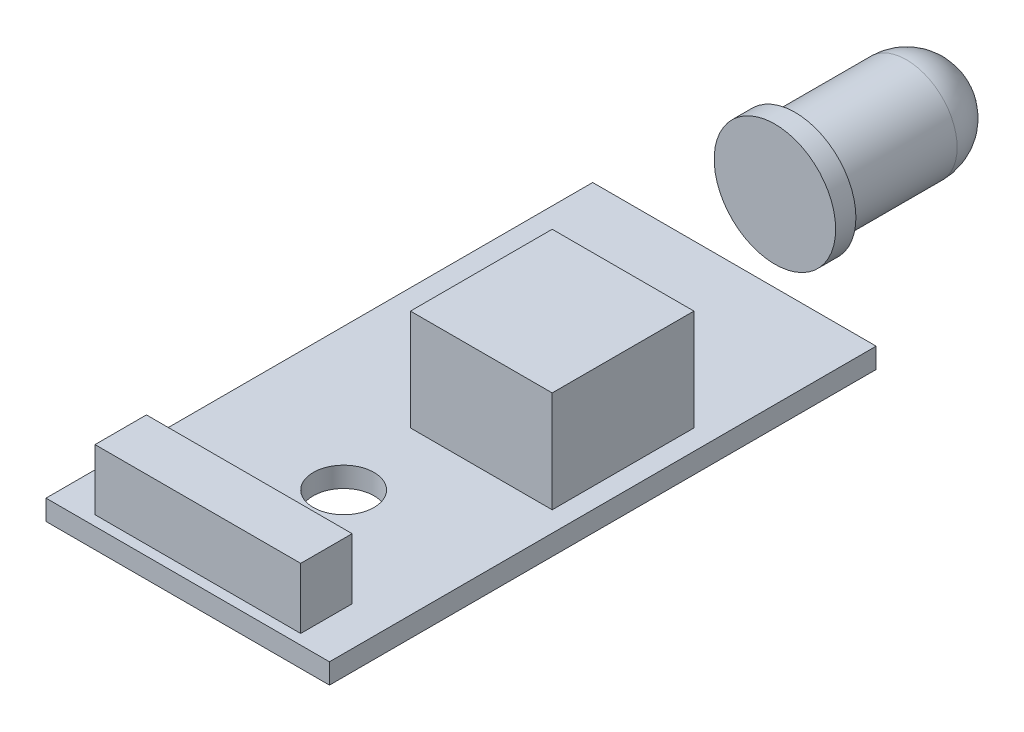
ISO-10303-21;
HEADER;
FILE_DESCRIPTION(('STEP AP214'),'2;1');
FILE_NAME('part.step','',(''),(''),'','','');
FILE_SCHEMA(('AUTOMOTIVE_DESIGN { 1 0 10303 214 1 1 1 1 }'));
ENDSEC;
DATA;
#1=APPLICATION_CONTEXT('core data for automotive mechanical design processes');
#2=APPLICATION_PROTOCOL_DEFINITION('international standard','automotive_design',2000,#1);
#3=PRODUCT_CONTEXT('',#1,'mechanical');
#4=PRODUCT('Part','Part','',(#3));
#5=PRODUCT_RELATED_PRODUCT_CATEGORY('part','',(#4));
#6=PRODUCT_DEFINITION_FORMATION('','',#4);
#7=PRODUCT_DEFINITION_CONTEXT('part definition',#1,'design');
#8=PRODUCT_DEFINITION('design','',#6,#7);
#9=PRODUCT_DEFINITION_SHAPE('','',#8);
#10=(LENGTH_UNIT() NAMED_UNIT(*) SI_UNIT(.MILLI.,.METRE.));
#11=(NAMED_UNIT(*) PLANE_ANGLE_UNIT() SI_UNIT($,.RADIAN.));
#12=(NAMED_UNIT(*) SI_UNIT($,.STERADIAN.) SOLID_ANGLE_UNIT());
#13=UNCERTAINTY_MEASURE_WITH_UNIT(LENGTH_MEASURE(1.E-05),#10,'distance_accuracy_value','');
#14=(GEOMETRIC_REPRESENTATION_CONTEXT(3) GLOBAL_UNCERTAINTY_ASSIGNED_CONTEXT((#13)) GLOBAL_UNIT_ASSIGNED_CONTEXT((#10,
#11,#12)) REPRESENTATION_CONTEXT('',''));
#15=CARTESIAN_POINT('',(0.,0.,0.));
#16=DIRECTION('',(0.,0.,1.));
#17=DIRECTION('',(1.,0.,0.));
#18=AXIS2_PLACEMENT_3D('',#15,#16,#17);
#19=CARTESIAN_POINT('',(0.,3.,-15.5));
#20=DIRECTION('',(0.,0.,-1.));
#21=DIRECTION('',(-1.,0.,0.));
#22=AXIS2_PLACEMENT_3D('',#19,#20,#21);
#23=PLANE('',#22);
#24=CARTESIAN_POINT('',(0.,3.,-15.5));
#25=DIRECTION('',(0.,0.,1.));
#26=DIRECTION('',(1.,0.,0.));
#27=AXIS2_PLACEMENT_3D('',#24,#25,#26);
#28=CIRCLE('',#27,3.);
#29=CARTESIAN_POINT('',(3.,3.,-15.5));
#30=VERTEX_POINT('',#29);
#31=EDGE_CURVE('E11',#30,#30,#28,.T.);
#32=ORIENTED_EDGE('',*,*,#31,.T.);
#33=EDGE_LOOP('',(#32));
#34=FACE_BOUND('',#33,.T.);
#35=ADVANCED_FACE('F47',(#34),#23,.F.);
#36=CARTESIAN_POINT('',(0.,3.,-15.5));
#37=DIRECTION('',(0.,0.,1.));
#38=DIRECTION('',(1.,0.,0.));
#39=AXIS2_PLACEMENT_3D('',#36,#37,#38);
#40=CYLINDRICAL_SURFACE('',#39,3.);
#41=ORIENTED_EDGE('',*,*,#31,.F.);
#42=EDGE_LOOP('',(#41));
#43=FACE_BOUND('',#42,.T.);
#44=CARTESIAN_POINT('',(0.,3.,-16.5));
#45=DIRECTION('',(0.,0.,1.));
#46=DIRECTION('',(1.,0.,0.));
#47=AXIS2_PLACEMENT_3D('',#44,#45,#46);
#48=CIRCLE('',#47,3.);
#49=CARTESIAN_POINT('',(3.,3.,-16.5));
#50=VERTEX_POINT('',#49);
#51=EDGE_CURVE('E53',#50,#50,#48,.T.);
#52=ORIENTED_EDGE('',*,*,#51,.T.);
#53=EDGE_LOOP('',(#52));
#54=FACE_BOUND('',#53,.T.);
#55=ADVANCED_FACE('F79',(#43,#54),#40,.T.);
#56=CARTESIAN_POINT('',(0.,6.,-16.5));
#57=DIRECTION('',(0.,0.,1.));
#58=DIRECTION('',(1.,0.,0.));
#59=AXIS2_PLACEMENT_3D('',#56,#57,#58);
#60=PLANE('',#59);
#61=ORIENTED_EDGE('',*,*,#51,.F.);
#62=EDGE_LOOP('',(#61));
#63=FACE_BOUND('',#62,.T.);
#64=CARTESIAN_POINT('',(0.,3.,-16.5));
#65=DIRECTION('',(0.,0.,1.));
#66=DIRECTION('',(1.,0.,0.));
#67=AXIS2_PLACEMENT_3D('',#64,#65,#66);
#68=CIRCLE('',#67,2.5);
#69=CARTESIAN_POINT('',(2.5,3.,-16.5));
#70=VERTEX_POINT('',#69);
#71=EDGE_CURVE('E57',#70,#70,#68,.T.);
#72=ORIENTED_EDGE('',*,*,#71,.T.);
#73=EDGE_LOOP('',(#72));
#74=FACE_BOUND('',#73,.T.);
#75=ADVANCED_FACE('F75',(#63,#74),#60,.F.);
#76=CARTESIAN_POINT('',(0.,3.,-15.5));
#77=DIRECTION('',(0.,0.,1.));
#78=DIRECTION('',(1.,0.,0.));
#79=AXIS2_PLACEMENT_3D('',#76,#77,#78);
#80=CYLINDRICAL_SURFACE('',#79,2.5);
#81=ORIENTED_EDGE('',*,*,#71,.F.);
#82=EDGE_LOOP('',(#81));
#83=FACE_BOUND('',#82,.T.);
#84=CARTESIAN_POINT('',(0.,3.,-22.));
#85=DIRECTION('',(0.,0.,1.));
#86=DIRECTION('',(1.,0.,0.));
#87=AXIS2_PLACEMENT_3D('',#84,#85,#86);
#88=CIRCLE('',#87,2.5);
#89=CARTESIAN_POINT('',(2.5,3.,-22.));
#90=VERTEX_POINT('',#89);
#91=EDGE_CURVE('E61',#90,#90,#88,.T.);
#92=ORIENTED_EDGE('',*,*,#91,.T.);
#93=EDGE_LOOP('',(#92));
#94=FACE_BOUND('',#93,.T.);
#95=ADVANCED_FACE('F67',(#83,#94),#80,.T.);
#96=CARTESIAN_POINT('',(0.,3.,-22.));
#97=DIRECTION('',(0.,0.,1.));
#98=DIRECTION('',(0.,1.,0.));
#99=AXIS2_PLACEMENT_3D('',#96,#97,#98);
#100=SPHERICAL_SURFACE('',#99,2.5);
#101=ORIENTED_EDGE('',*,*,#91,.F.);
#102=EDGE_LOOP('',(#101));
#103=FACE_BOUND('',#102,.T.);
#104=ADVANCED_FACE('F69',(#103),#100,.T.);
#105=CLOSED_SHELL('',(#35,#55,#75,#95,#104));
#106=MANIFOLD_SOLID_BREP('B2',#105);
#107=CARTESIAN_POINT('',(0.,1.,0.));
#108=DIRECTION('',(0.,1.,0.));
#109=DIRECTION('',(0.,0.,1.));
#110=AXIS2_PLACEMENT_3D('',#107,#108,#109);
#111=PLANE('',#110);
#112=CARTESIAN_POINT('',(0.,1.,5.8));
#113=DIRECTION('',(0.,1.,0.));
#114=DIRECTION('',(0.,0.,1.));
#115=AXIS2_PLACEMENT_3D('',#112,#113,#114);
#116=CIRCLE('',#115,1.5);
#117=CARTESIAN_POINT('',(0.,1.,7.3));
#118=VERTEX_POINT('',#117);
#119=EDGE_CURVE('E264',#118,#118,#116,.T.);
#120=ORIENTED_EDGE('',*,*,#119,.F.);
#121=EDGE_LOOP('',(#120));
#122=FACE_BOUND('',#121,.T.);
#123=DIRECTION('',(0.,0.,-1.));
#124=VECTOR('',#123,1.);
#125=CARTESIAN_POINT('',(7.,1.,-13.5));
#126=LINE('',#125,#124);
#127=CARTESIAN_POINT('',(7.,1.,13.5));
#128=VERTEX_POINT('',#127);
#129=CARTESIAN_POINT('',(7.,1.,-13.5));
#130=VERTEX_POINT('',#129);
#131=EDGE_CURVE('E271',#128,#130,#126,.T.);
#132=ORIENTED_EDGE('',*,*,#131,.T.);
#133=DIRECTION('',(-1.,0.,0.));
#134=VECTOR('',#133,1.);
#135=CARTESIAN_POINT('',(-7.,1.,-13.5));
#136=LINE('',#135,#134);
#137=CARTESIAN_POINT('',(-7.,1.,-13.5));
#138=VERTEX_POINT('',#137);
#139=EDGE_CURVE('E274',#130,#138,#136,.T.);
#140=ORIENTED_EDGE('',*,*,#139,.T.);
#141=DIRECTION('',(0.,0.,1.));
#142=VECTOR('',#141,1.);
#143=CARTESIAN_POINT('',(-7.,1.,-13.5));
#144=LINE('',#143,#142);
#145=CARTESIAN_POINT('',(-7.,1.,13.5));
#146=VERTEX_POINT('',#145);
#147=EDGE_CURVE('E277',#138,#146,#144,.T.);
#148=ORIENTED_EDGE('',*,*,#147,.T.);
#149=DIRECTION('',(1.,0.,0.));
#150=VECTOR('',#149,1.);
#151=CARTESIAN_POINT('',(-7.,1.,13.5));
#152=LINE('',#151,#150);
#153=EDGE_CURVE('E279',#146,#128,#152,.T.);
#154=ORIENTED_EDGE('',*,*,#153,.T.);
#155=EDGE_LOOP('',(#132,#140,#148,#154));
#156=FACE_BOUND('',#155,.T.);
#157=DIRECTION('',(1.,0.,0.));
#158=VECTOR('',#157,1.);
#159=CARTESIAN_POINT('',(-0.999999999999997,1.,1.5));
#160=LINE('',#159,#158);
#161=CARTESIAN_POINT('',(-0.999999999999997,1.,1.5));
#162=VERTEX_POINT('',#161);
#163=CARTESIAN_POINT('',(6.,1.,1.5));
#164=VERTEX_POINT('',#163);
#165=EDGE_CURVE('E236',#162,#164,#160,.T.);
#166=ORIENTED_EDGE('',*,*,#165,.F.);
#167=DIRECTION('',(0.,0.,1.));
#168=VECTOR('',#167,1.);
#169=CARTESIAN_POINT('',(-0.999999999999997,1.,-5.5));
#170=LINE('',#169,#168);
#171=CARTESIAN_POINT('',(-0.999999999999997,1.,-5.5));
#172=VERTEX_POINT('',#171);
#173=EDGE_CURVE('E233',#172,#162,#170,.T.);
#174=ORIENTED_EDGE('',*,*,#173,.F.);
#175=DIRECTION('',(-1.,0.,0.));
#176=VECTOR('',#175,1.);
#177=CARTESIAN_POINT('',(-0.999999999999997,1.,-5.5));
#178=LINE('',#177,#176);
#179=CARTESIAN_POINT('',(6.,1.,-5.5));
#180=VERTEX_POINT('',#179);
#181=EDGE_CURVE('E245',#180,#172,#178,.T.);
#182=ORIENTED_EDGE('',*,*,#181,.F.);
#183=DIRECTION('',(0.,0.,-1.));
#184=VECTOR('',#183,1.);
#185=CARTESIAN_POINT('',(6.,1.,-5.5));
#186=LINE('',#185,#184);
#187=EDGE_CURVE('E253',#164,#180,#186,.T.);
#188=ORIENTED_EDGE('',*,*,#187,.F.);
#189=EDGE_LOOP('',(#166,#174,#182,#188));
#190=FACE_BOUND('',#189,.T.);
#191=DIRECTION('',(-1.,0.,0.));
#192=VECTOR('',#191,1.);
#193=CARTESIAN_POINT('',(-5.08,1.,10.46));
#194=LINE('',#193,#192);
#195=CARTESIAN_POINT('',(5.08,1.,10.46));
#196=VERTEX_POINT('',#195);
#197=CARTESIAN_POINT('',(-5.08,1.,10.46));
#198=VERTEX_POINT('',#197);
#199=EDGE_CURVE('E443',#196,#198,#194,.T.);
#200=ORIENTED_EDGE('',*,*,#199,.F.);
#201=DIRECTION('',(0.,0.,-1.));
#202=VECTOR('',#201,1.);
#203=CARTESIAN_POINT('',(5.08,1.,10.46));
#204=LINE('',#203,#202);
#205=CARTESIAN_POINT('',(5.08,1.,13.));
#206=VERTEX_POINT('',#205);
#207=EDGE_CURVE('E231',#206,#196,#204,.T.);
#208=ORIENTED_EDGE('',*,*,#207,.F.);
#209=DIRECTION('',(1.,0.,0.));
#210=VECTOR('',#209,1.);
#211=CARTESIAN_POINT('',(-5.08,1.,13.));
#212=LINE('',#211,#210);
#213=CARTESIAN_POINT('',(-5.08,1.,13.));
#214=VERTEX_POINT('',#213);
#215=EDGE_CURVE('E227',#214,#206,#212,.T.);
#216=ORIENTED_EDGE('',*,*,#215,.F.);
#217=DIRECTION('',(0.,0.,1.));
#218=VECTOR('',#217,1.);
#219=CARTESIAN_POINT('',(-5.08,1.,10.46));
#220=LINE('',#219,#218);
#221=EDGE_CURVE('E440',#198,#214,#220,.T.);
#222=ORIENTED_EDGE('',*,*,#221,.F.);
#223=EDGE_LOOP('',(#200,#208,#216,#222));
#224=FACE_BOUND('',#223,.T.);
#225=ADVANCED_FACE('F118',(#122,#156,#190,#224),#111,.T.);
#226=CARTESIAN_POINT('',(7.,1.,-13.5));
#227=DIRECTION('',(-1.,0.,0.));
#228=DIRECTION('',(0.,0.,1.));
#229=AXIS2_PLACEMENT_3D('',#226,#227,#228);
#230=PLANE('',#229);
#231=DIRECTION('',(0.,0.,-1.));
#232=VECTOR('',#231,1.);
#233=CARTESIAN_POINT('',(7.,0.,-13.5));
#234=LINE('',#233,#232);
#235=CARTESIAN_POINT('',(7.,0.,13.5));
#236=VERTEX_POINT('',#235);
#237=CARTESIAN_POINT('',(7.,0.,-13.5));
#238=VERTEX_POINT('',#237);
#239=EDGE_CURVE('E268',#236,#238,#234,.T.);
#240=ORIENTED_EDGE('',*,*,#239,.T.);
#241=DIRECTION('',(0.,-1.,0.));
#242=VECTOR('',#241,1.);
#243=CARTESIAN_POINT('',(7.,1.,-13.5));
#244=LINE('',#243,#242);
#245=EDGE_CURVE('E45',#130,#238,#244,.T.);
#246=ORIENTED_EDGE('',*,*,#245,.F.);
#247=ORIENTED_EDGE('',*,*,#131,.F.);
#248=DIRECTION('',(0.,-1.,0.));
#249=VECTOR('',#248,1.);
#250=CARTESIAN_POINT('',(7.,1.,13.5));
#251=LINE('',#250,#249);
#252=EDGE_CURVE('E281',#128,#236,#251,.T.);
#253=ORIENTED_EDGE('',*,*,#252,.T.);
#254=EDGE_LOOP('',(#240,#246,#247,#253));
#255=FACE_BOUND('',#254,.T.);
#256=ADVANCED_FACE('F120',(#255),#230,.F.);
#257=CARTESIAN_POINT('',(-7.,1.,-13.5));
#258=DIRECTION('',(0.,0.,1.));
#259=DIRECTION('',(1.,0.,0.));
#260=AXIS2_PLACEMENT_3D('',#257,#258,#259);
#261=PLANE('',#260);
#262=DIRECTION('',(-1.,0.,0.));
#263=VECTOR('',#262,1.);
#264=CARTESIAN_POINT('',(-7.,0.,-13.5));
#265=LINE('',#264,#263);
#266=CARTESIAN_POINT('',(-7.,0.,-13.5));
#267=VERTEX_POINT('',#266);
#268=EDGE_CURVE('E284',#238,#267,#265,.T.);
#269=ORIENTED_EDGE('',*,*,#268,.T.);
#270=DIRECTION('',(0.,-1.,0.));
#271=VECTOR('',#270,1.);
#272=CARTESIAN_POINT('',(-7.,1.,-13.5));
#273=LINE('',#272,#271);
#274=EDGE_CURVE('E126',#138,#267,#273,.T.);
#275=ORIENTED_EDGE('',*,*,#274,.F.);
#276=ORIENTED_EDGE('',*,*,#139,.F.);
#277=ORIENTED_EDGE('',*,*,#245,.T.);
#278=EDGE_LOOP('',(#269,#275,#276,#277));
#279=FACE_BOUND('',#278,.T.);
#280=ADVANCED_FACE('F314',(#279),#261,.F.);
#281=CARTESIAN_POINT('',(-7.,1.,-13.5));
#282=DIRECTION('',(1.,0.,0.));
#283=DIRECTION('',(0.,0.,-1.));
#284=AXIS2_PLACEMENT_3D('',#281,#282,#283);
#285=PLANE('',#284);
#286=DIRECTION('',(0.,0.,1.));
#287=VECTOR('',#286,1.);
#288=CARTESIAN_POINT('',(-7.,0.,-13.5));
#289=LINE('',#288,#287);
#290=CARTESIAN_POINT('',(-7.,0.,13.5));
#291=VERTEX_POINT('',#290);
#292=EDGE_CURVE('E286',#267,#291,#289,.T.);
#293=ORIENTED_EDGE('',*,*,#292,.T.);
#294=DIRECTION('',(0.,-1.,0.));
#295=VECTOR('',#294,1.);
#296=CARTESIAN_POINT('',(-7.,1.,13.5));
#297=LINE('',#296,#295);
#298=EDGE_CURVE('E291',#146,#291,#297,.T.);
#299=ORIENTED_EDGE('',*,*,#298,.F.);
#300=ORIENTED_EDGE('',*,*,#147,.F.);
#301=ORIENTED_EDGE('',*,*,#274,.T.);
#302=EDGE_LOOP('',(#293,#299,#300,#301));
#303=FACE_BOUND('',#302,.T.);
#304=ADVANCED_FACE('F298',(#303),#285,.F.);
#305=CARTESIAN_POINT('',(-7.,1.,13.5));
#306=DIRECTION('',(0.,0.,-1.));
#307=DIRECTION('',(-1.,0.,0.));
#308=AXIS2_PLACEMENT_3D('',#305,#306,#307);
#309=PLANE('',#308);
#310=DIRECTION('',(1.,0.,0.));
#311=VECTOR('',#310,1.);
#312=CARTESIAN_POINT('',(-7.,0.,13.5));
#313=LINE('',#312,#311);
#314=EDGE_CURVE('E275',#291,#236,#313,.T.);
#315=ORIENTED_EDGE('',*,*,#314,.T.);
#316=ORIENTED_EDGE('',*,*,#252,.F.);
#317=ORIENTED_EDGE('',*,*,#153,.F.);
#318=ORIENTED_EDGE('',*,*,#298,.T.);
#319=EDGE_LOOP('',(#315,#316,#317,#318));
#320=FACE_BOUND('',#319,.T.);
#321=ADVANCED_FACE('F307',(#320),#309,.F.);
#322=CARTESIAN_POINT('',(0.,0.,0.));
#323=DIRECTION('',(0.,1.,0.));
#324=DIRECTION('',(0.,0.,1.));
#325=AXIS2_PLACEMENT_3D('',#322,#323,#324);
#326=PLANE('',#325);
#327=CARTESIAN_POINT('',(0.,0.,5.8));
#328=DIRECTION('',(0.,1.,0.));
#329=DIRECTION('',(0.,0.,1.));
#330=AXIS2_PLACEMENT_3D('',#327,#328,#329);
#331=CIRCLE('',#330,1.5);
#332=CARTESIAN_POINT('',(0.,0.,7.3));
#333=VERTEX_POINT('',#332);
#334=EDGE_CURVE('E265',#333,#333,#331,.T.);
#335=ORIENTED_EDGE('',*,*,#334,.T.);
#336=EDGE_LOOP('',(#335));
#337=FACE_BOUND('',#336,.T.);
#338=ORIENTED_EDGE('',*,*,#239,.F.);
#339=ORIENTED_EDGE('',*,*,#314,.F.);
#340=ORIENTED_EDGE('',*,*,#292,.F.);
#341=ORIENTED_EDGE('',*,*,#268,.F.);
#342=EDGE_LOOP('',(#338,#339,#340,#341));
#343=FACE_BOUND('',#342,.T.);
#344=ADVANCED_FACE('F304',(#337,#343),#326,.F.);
#345=CARTESIAN_POINT('',(0.,0.,5.8));
#346=DIRECTION('',(0.,1.,0.));
#347=DIRECTION('',(0.,0.,1.));
#348=AXIS2_PLACEMENT_3D('',#345,#346,#347);
#349=CYLINDRICAL_SURFACE('',#348,1.5);
#350=ORIENTED_EDGE('',*,*,#334,.F.);
#351=EDGE_LOOP('',(#350));
#352=FACE_BOUND('',#351,.T.);
#353=ORIENTED_EDGE('',*,*,#119,.T.);
#354=EDGE_LOOP('',(#353));
#355=FACE_BOUND('',#354,.T.);
#356=ADVANCED_FACE('F331',(#352,#355),#349,.F.);
#357=CARTESIAN_POINT('',(-0.999999999999997,6.,-5.5));
#358=DIRECTION('',(1.,0.,0.));
#359=DIRECTION('',(0.,0.,-1.));
#360=AXIS2_PLACEMENT_3D('',#357,#358,#359);
#361=PLANE('',#360);
#362=ORIENTED_EDGE('',*,*,#173,.T.);
#363=DIRECTION('',(0.,-1.,0.));
#364=VECTOR('',#363,1.);
#365=CARTESIAN_POINT('',(-0.999999999999997,6.,1.5));
#366=LINE('',#365,#364);
#367=CARTESIAN_POINT('',(-0.999999999999997,6.,1.5));
#368=VERTEX_POINT('',#367);
#369=EDGE_CURVE('E262',#368,#162,#366,.T.);
#370=ORIENTED_EDGE('',*,*,#369,.F.);
#371=DIRECTION('',(0.,0.,1.));
#372=VECTOR('',#371,1.);
#373=CARTESIAN_POINT('',(-0.999999999999997,6.,-5.5));
#374=LINE('',#373,#372);
#375=CARTESIAN_POINT('',(-0.999999999999997,6.,-5.5));
#376=VERTEX_POINT('',#375);
#377=EDGE_CURVE('E241',#376,#368,#374,.T.);
#378=ORIENTED_EDGE('',*,*,#377,.F.);
#379=DIRECTION('',(0.,-1.,0.));
#380=VECTOR('',#379,1.);
#381=CARTESIAN_POINT('',(-0.999999999999997,6.,-5.5));
#382=LINE('',#381,#380);
#383=EDGE_CURVE('E250',#376,#172,#382,.T.);
#384=ORIENTED_EDGE('',*,*,#383,.T.);
#385=EDGE_LOOP('',(#362,#370,#378,#384));
#386=FACE_BOUND('',#385,.T.);
#387=ADVANCED_FACE('F351',(#386),#361,.F.);
#388=CARTESIAN_POINT('',(-0.999999999999997,6.,1.5));
#389=DIRECTION('',(0.,0.,-1.));
#390=DIRECTION('',(-1.,0.,0.));
#391=AXIS2_PLACEMENT_3D('',#388,#389,#390);
#392=PLANE('',#391);
#393=ORIENTED_EDGE('',*,*,#165,.T.);
#394=DIRECTION('',(0.,-1.,0.));
#395=VECTOR('',#394,1.);
#396=CARTESIAN_POINT('',(6.,6.,1.5));
#397=LINE('',#396,#395);
#398=CARTESIAN_POINT('',(6.,6.,1.5));
#399=VERTEX_POINT('',#398);
#400=EDGE_CURVE('E259',#399,#164,#397,.T.);
#401=ORIENTED_EDGE('',*,*,#400,.F.);
#402=DIRECTION('',(1.,0.,0.));
#403=VECTOR('',#402,1.);
#404=CARTESIAN_POINT('',(-0.999999999999997,6.,1.5));
#405=LINE('',#404,#403);
#406=EDGE_CURVE('E244',#368,#399,#405,.T.);
#407=ORIENTED_EDGE('',*,*,#406,.F.);
#408=ORIENTED_EDGE('',*,*,#369,.T.);
#409=EDGE_LOOP('',(#393,#401,#407,#408));
#410=FACE_BOUND('',#409,.T.);
#411=ADVANCED_FACE('F358',(#410),#392,.F.);
#412=CARTESIAN_POINT('',(6.,6.,-5.5));
#413=DIRECTION('',(-1.,0.,0.));
#414=DIRECTION('',(0.,0.,1.));
#415=AXIS2_PLACEMENT_3D('',#412,#413,#414);
#416=PLANE('',#415);
#417=ORIENTED_EDGE('',*,*,#187,.T.);
#418=DIRECTION('',(0.,-1.,0.));
#419=VECTOR('',#418,1.);
#420=CARTESIAN_POINT('',(6.,6.,-5.5));
#421=LINE('',#420,#419);
#422=CARTESIAN_POINT('',(6.,6.,-5.5));
#423=VERTEX_POINT('',#422);
#424=EDGE_CURVE('E141',#423,#180,#421,.T.);
#425=ORIENTED_EDGE('',*,*,#424,.F.);
#426=DIRECTION('',(0.,0.,-1.));
#427=VECTOR('',#426,1.);
#428=CARTESIAN_POINT('',(6.,6.,-5.5));
#429=LINE('',#428,#427);
#430=EDGE_CURVE('E247',#399,#423,#429,.T.);
#431=ORIENTED_EDGE('',*,*,#430,.F.);
#432=ORIENTED_EDGE('',*,*,#400,.T.);
#433=EDGE_LOOP('',(#417,#425,#431,#432));
#434=FACE_BOUND('',#433,.T.);
#435=ADVANCED_FACE('F365',(#434),#416,.F.);
#436=CARTESIAN_POINT('',(-0.999999999999997,6.,-5.5));
#437=DIRECTION('',(0.,0.,1.));
#438=DIRECTION('',(1.,0.,0.));
#439=AXIS2_PLACEMENT_3D('',#436,#437,#438);
#440=PLANE('',#439);
#441=ORIENTED_EDGE('',*,*,#181,.T.);
#442=ORIENTED_EDGE('',*,*,#383,.F.);
#443=DIRECTION('',(-1.,0.,0.));
#444=VECTOR('',#443,1.);
#445=CARTESIAN_POINT('',(-0.999999999999997,6.,-5.5));
#446=LINE('',#445,#444);
#447=EDGE_CURVE('E249',#423,#376,#446,.T.);
#448=ORIENTED_EDGE('',*,*,#447,.F.);
#449=ORIENTED_EDGE('',*,*,#424,.T.);
#450=EDGE_LOOP('',(#441,#442,#448,#449));
#451=FACE_BOUND('',#450,.T.);
#452=ADVANCED_FACE('F373',(#451),#440,.F.);
#453=CARTESIAN_POINT('',(0.,6.,0.));
#454=DIRECTION('',(0.,1.,0.));
#455=DIRECTION('',(0.,0.,1.));
#456=AXIS2_PLACEMENT_3D('',#453,#454,#455);
#457=PLANE('',#456);
#458=ORIENTED_EDGE('',*,*,#377,.T.);
#459=ORIENTED_EDGE('',*,*,#406,.T.);
#460=ORIENTED_EDGE('',*,*,#430,.T.);
#461=ORIENTED_EDGE('',*,*,#447,.T.);
#462=EDGE_LOOP('',(#458,#459,#460,#461));
#463=FACE_BOUND('',#462,.T.);
#464=ADVANCED_FACE('F381',(#463),#457,.T.);
#465=CARTESIAN_POINT('',(5.08,4.,10.46));
#466=DIRECTION('',(-1.,0.,0.));
#467=DIRECTION('',(0.,0.,1.));
#468=AXIS2_PLACEMENT_3D('',#465,#466,#467);
#469=PLANE('',#468);
#470=ORIENTED_EDGE('',*,*,#207,.T.);
#471=DIRECTION('',(0.,-1.,0.));
#472=VECTOR('',#471,1.);
#473=CARTESIAN_POINT('',(5.08,4.,10.46));
#474=LINE('',#473,#472);
#475=CARTESIAN_POINT('',(5.08,4.,10.46));
#476=VERTEX_POINT('',#475);
#477=EDGE_CURVE('E212',#476,#196,#474,.T.);
#478=ORIENTED_EDGE('',*,*,#477,.F.);
#479=DIRECTION('',(0.,0.,-1.));
#480=VECTOR('',#479,1.);
#481=CARTESIAN_POINT('',(5.08,4.,10.46));
#482=LINE('',#481,#480);
#483=CARTESIAN_POINT('',(5.08,4.,13.));
#484=VERTEX_POINT('',#483);
#485=EDGE_CURVE('E219',#484,#476,#482,.T.);
#486=ORIENTED_EDGE('',*,*,#485,.F.);
#487=DIRECTION('',(0.,-1.,0.));
#488=VECTOR('',#487,1.);
#489=CARTESIAN_POINT('',(5.08,4.,13.));
#490=LINE('',#489,#488);
#491=EDGE_CURVE('E437',#484,#206,#490,.T.);
#492=ORIENTED_EDGE('',*,*,#491,.T.);
#493=EDGE_LOOP('',(#470,#478,#486,#492));
#494=FACE_BOUND('',#493,.T.);
#495=ADVANCED_FACE('F229',(#494),#469,.F.);
#496=CARTESIAN_POINT('',(-5.08,4.,10.46));
#497=DIRECTION('',(0.,0.,1.));
#498=DIRECTION('',(1.,0.,0.));
#499=AXIS2_PLACEMENT_3D('',#496,#497,#498);
#500=PLANE('',#499);
#501=ORIENTED_EDGE('',*,*,#199,.T.);
#502=DIRECTION('',(0.,-1.,0.));
#503=VECTOR('',#502,1.);
#504=CARTESIAN_POINT('',(-5.08,4.,10.46));
#505=LINE('',#504,#503);
#506=CARTESIAN_POINT('',(-5.08,4.,10.46));
#507=VERTEX_POINT('',#506);
#508=EDGE_CURVE('E215',#507,#198,#505,.T.);
#509=ORIENTED_EDGE('',*,*,#508,.F.);
#510=DIRECTION('',(-1.,0.,0.));
#511=VECTOR('',#510,1.);
#512=CARTESIAN_POINT('',(-5.08,4.,10.46));
#513=LINE('',#512,#511);
#514=EDGE_CURVE('E208',#476,#507,#513,.T.);
#515=ORIENTED_EDGE('',*,*,#514,.F.);
#516=ORIENTED_EDGE('',*,*,#477,.T.);
#517=EDGE_LOOP('',(#501,#509,#515,#516));
#518=FACE_BOUND('',#517,.T.);
#519=ADVANCED_FACE('F210',(#518),#500,.F.);
#520=CARTESIAN_POINT('',(-5.08,4.,10.46));
#521=DIRECTION('',(1.,0.,0.));
#522=DIRECTION('',(0.,0.,-1.));
#523=AXIS2_PLACEMENT_3D('',#520,#521,#522);
#524=PLANE('',#523);
#525=ORIENTED_EDGE('',*,*,#221,.T.);
#526=DIRECTION('',(0.,-1.,0.));
#527=VECTOR('',#526,1.);
#528=CARTESIAN_POINT('',(-5.08,4.,13.));
#529=LINE('',#528,#527);
#530=CARTESIAN_POINT('',(-5.08,4.,13.));
#531=VERTEX_POINT('',#530);
#532=EDGE_CURVE('E133',#531,#214,#529,.T.);
#533=ORIENTED_EDGE('',*,*,#532,.F.);
#534=DIRECTION('',(0.,0.,1.));
#535=VECTOR('',#534,1.);
#536=CARTESIAN_POINT('',(-5.08,4.,10.46));
#537=LINE('',#536,#535);
#538=EDGE_CURVE('E218',#507,#531,#537,.T.);
#539=ORIENTED_EDGE('',*,*,#538,.F.);
#540=ORIENTED_EDGE('',*,*,#508,.T.);
#541=EDGE_LOOP('',(#525,#533,#539,#540));
#542=FACE_BOUND('',#541,.T.);
#543=ADVANCED_FACE('F403',(#542),#524,.F.);
#544=CARTESIAN_POINT('',(-5.08,4.,13.));
#545=DIRECTION('',(0.,0.,-1.));
#546=DIRECTION('',(-1.,0.,0.));
#547=AXIS2_PLACEMENT_3D('',#544,#545,#546);
#548=PLANE('',#547);
#549=ORIENTED_EDGE('',*,*,#215,.T.);
#550=ORIENTED_EDGE('',*,*,#491,.F.);
#551=DIRECTION('',(1.,0.,0.));
#552=VECTOR('',#551,1.);
#553=CARTESIAN_POINT('',(-5.08,4.,13.));
#554=LINE('',#553,#552);
#555=EDGE_CURVE('E223',#531,#484,#554,.T.);
#556=ORIENTED_EDGE('',*,*,#555,.F.);
#557=ORIENTED_EDGE('',*,*,#532,.T.);
#558=EDGE_LOOP('',(#549,#550,#556,#557));
#559=FACE_BOUND('',#558,.T.);
#560=ADVANCED_FACE('F410',(#559),#548,.F.);
#561=CARTESIAN_POINT('',(0.,4.,0.));
#562=DIRECTION('',(0.,1.,0.));
#563=DIRECTION('',(0.,0.,1.));
#564=AXIS2_PLACEMENT_3D('',#561,#562,#563);
#565=PLANE('',#564);
#566=ORIENTED_EDGE('',*,*,#485,.T.);
#567=ORIENTED_EDGE('',*,*,#514,.T.);
#568=ORIENTED_EDGE('',*,*,#538,.T.);
#569=ORIENTED_EDGE('',*,*,#555,.T.);
#570=EDGE_LOOP('',(#566,#567,#568,#569));
#571=FACE_BOUND('',#570,.T.);
#572=ADVANCED_FACE('F222',(#571),#565,.T.);
#573=CLOSED_SHELL('',(#225,#256,#280,#304,#321,#344,#356,#387,#411,#435,#452,#464,#495,#519,
#543,#560,#572));
#574=MANIFOLD_SOLID_BREP('B6',#573);
#575=ADVANCED_BREP_SHAPE_REPRESENTATION('',(#18,#106,#574),#14);
#576=SHAPE_DEFINITION_REPRESENTATION(#9,#575);
ENDSEC;
END-ISO-10303-21;
